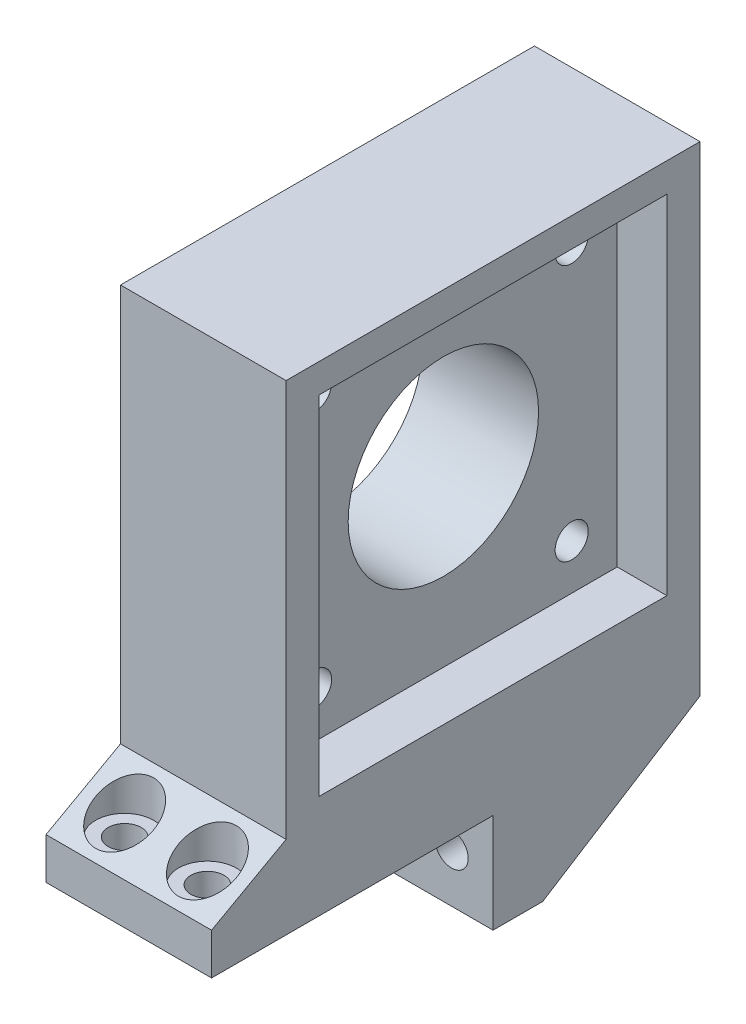
ISO-10303-21;
HEADER;
FILE_DESCRIPTION(('STEP AP214'),'2;1');
FILE_NAME('part.step','',(''),(''),'','','');
FILE_SCHEMA(('AUTOMOTIVE_DESIGN { 1 0 10303 214 1 1 1 1 }'));
ENDSEC;
DATA;
#1=APPLICATION_CONTEXT('core data for automotive mechanical design processes');
#2=APPLICATION_PROTOCOL_DEFINITION('international standard','automotive_design',2000,#1);
#3=PRODUCT_CONTEXT('',#1,'mechanical');
#4=PRODUCT('Part','Part','',(#3));
#5=PRODUCT_RELATED_PRODUCT_CATEGORY('part','',(#4));
#6=PRODUCT_DEFINITION_FORMATION('','',#4);
#7=PRODUCT_DEFINITION_CONTEXT('part definition',#1,'design');
#8=PRODUCT_DEFINITION('design','',#6,#7);
#9=PRODUCT_DEFINITION_SHAPE('','',#8);
#10=(LENGTH_UNIT() NAMED_UNIT(*) SI_UNIT(.MILLI.,.METRE.));
#11=(NAMED_UNIT(*) PLANE_ANGLE_UNIT() SI_UNIT($,.RADIAN.));
#12=(NAMED_UNIT(*) SI_UNIT($,.STERADIAN.) SOLID_ANGLE_UNIT());
#13=UNCERTAINTY_MEASURE_WITH_UNIT(LENGTH_MEASURE(1.E-05),#10,'distance_accuracy_value','');
#14=(GEOMETRIC_REPRESENTATION_CONTEXT(3) GLOBAL_UNCERTAINTY_ASSIGNED_CONTEXT((#13)) GLOBAL_UNIT_ASSIGNED_CONTEXT((#10,
#11,#12)) REPRESENTATION_CONTEXT('',''));
#15=CARTESIAN_POINT('',(0.,0.,0.));
#16=DIRECTION('',(0.,0.,1.));
#17=DIRECTION('',(1.,0.,0.));
#18=AXIS2_PLACEMENT_3D('',#15,#16,#17);
#19=CARTESIAN_POINT('',(-15.,22.,54.5));
#20=DIRECTION('',(0.,-1.,0.));
#21=DIRECTION('',(0.,0.,-1.));
#22=AXIS2_PLACEMENT_3D('',#19,#20,#21);
#23=CYLINDRICAL_SURFACE('',#22,2.00000000000001);
#24=CARTESIAN_POINT('',(-15.,12.,54.5));
#25=DIRECTION('',(0.,-1.,0.));
#26=DIRECTION('',(0.,0.,-1.));
#27=AXIS2_PLACEMENT_3D('',#24,#25,#26);
#28=CIRCLE('',#27,2.00000000000001);
#29=CARTESIAN_POINT('',(-15.,12.,52.5));
#30=VERTEX_POINT('',#29);
#31=EDGE_CURVE('E222',#30,#30,#28,.T.);
#32=ORIENTED_EDGE('',*,*,#31,.T.);
#33=EDGE_LOOP('',(#32));
#34=FACE_BOUND('',#33,.T.);
#35=CARTESIAN_POINT('',(-15.,17.,54.5));
#36=DIRECTION('',(0.,1.,0.));
#37=DIRECTION('',(0.,0.,1.));
#38=AXIS2_PLACEMENT_3D('',#35,#36,#37);
#39=CIRCLE('',#38,2.00000000000001);
#40=CARTESIAN_POINT('',(-15.,17.,56.5));
#41=VERTEX_POINT('',#40);
#42=EDGE_CURVE('E209',#41,#41,#39,.F.);
#43=ORIENTED_EDGE('',*,*,#42,.F.);
#44=EDGE_LOOP('',(#43));
#45=FACE_BOUND('',#44,.T.);
#46=ADVANCED_FACE('F39',(#34,#45),#23,.F.);
#47=CARTESIAN_POINT('',(-5.,22.,54.5));
#48=DIRECTION('',(0.,-1.,0.));
#49=DIRECTION('',(0.,0.,-1.));
#50=AXIS2_PLACEMENT_3D('',#47,#48,#49);
#51=CYLINDRICAL_SURFACE('',#50,2.);
#52=CARTESIAN_POINT('',(-5.,12.,54.5));
#53=DIRECTION('',(0.,-1.,0.));
#54=DIRECTION('',(0.,0.,-1.));
#55=AXIS2_PLACEMENT_3D('',#52,#53,#54);
#56=CIRCLE('',#55,2.);
#57=CARTESIAN_POINT('',(-5.,12.,52.5));
#58=VERTEX_POINT('',#57);
#59=EDGE_CURVE('E263',#58,#58,#56,.T.);
#60=ORIENTED_EDGE('',*,*,#59,.T.);
#61=EDGE_LOOP('',(#60));
#62=FACE_BOUND('',#61,.T.);
#63=CARTESIAN_POINT('',(-5.,17.,54.5));
#64=DIRECTION('',(0.,1.,0.));
#65=DIRECTION('',(0.,0.,1.));
#66=AXIS2_PLACEMENT_3D('',#63,#64,#65);
#67=CIRCLE('',#66,2.);
#68=CARTESIAN_POINT('',(-5.,17.,56.5));
#69=VERTEX_POINT('',#68);
#70=EDGE_CURVE('E205',#69,#69,#67,.F.);
#71=ORIENTED_EDGE('',*,*,#70,.F.);
#72=EDGE_LOOP('',(#71));
#73=FACE_BOUND('',#72,.T.);
#74=ADVANCED_FACE('F427',(#62,#73),#51,.F.);
#75=CARTESIAN_POINT('',(0.,70.,50.));
#76=DIRECTION('',(0.,0.,-1.));
#77=DIRECTION('',(-1.,0.,0.));
#78=AXIS2_PLACEMENT_3D('',#75,#76,#77);
#79=PLANE('',#78);
#80=DIRECTION('',(0.,-1.,0.));
#81=VECTOR('',#80,1.);
#82=CARTESIAN_POINT('',(-20.,70.,50.));
#83=LINE('',#82,#81);
#84=CARTESIAN_POINT('',(-20.,70.,50.));
#85=VERTEX_POINT('',#84);
#86=CARTESIAN_POINT('',(-20.,22.,50.));
#87=VERTEX_POINT('',#86);
#88=EDGE_CURVE('E155',#85,#87,#83,.T.);
#89=ORIENTED_EDGE('',*,*,#88,.T.);
#90=DIRECTION('',(1.,0.,0.));
#91=VECTOR('',#90,1.);
#92=CARTESIAN_POINT('',(-20.,22.,50.));
#93=LINE('',#92,#91);
#94=CARTESIAN_POINT('',(0.,22.,50.));
#95=VERTEX_POINT('',#94);
#96=EDGE_CURVE('E135',#87,#95,#93,.T.);
#97=ORIENTED_EDGE('',*,*,#96,.T.);
#98=DIRECTION('',(0.,-1.,0.));
#99=VECTOR('',#98,1.);
#100=CARTESIAN_POINT('',(0.,70.,50.));
#101=LINE('',#100,#99);
#102=CARTESIAN_POINT('',(0.,70.,50.));
#103=VERTEX_POINT('',#102);
#104=EDGE_CURVE('E165',#103,#95,#101,.T.);
#105=ORIENTED_EDGE('',*,*,#104,.F.);
#106=DIRECTION('',(1.,0.,0.));
#107=VECTOR('',#106,1.);
#108=CARTESIAN_POINT('',(0.,70.,50.));
#109=LINE('',#108,#107);
#110=EDGE_CURVE('E162',#85,#103,#109,.T.);
#111=ORIENTED_EDGE('',*,*,#110,.F.);
#112=EDGE_LOOP('',(#89,#97,#105,#111));
#113=FACE_BOUND('',#112,.T.);
#114=ADVANCED_FACE('F161',(#113),#79,.F.);
#115=CARTESIAN_POINT('',(0.,70.,0.));
#116=DIRECTION('',(-1.,0.,0.));
#117=DIRECTION('',(0.,0.,1.));
#118=AXIS2_PLACEMENT_3D('',#115,#116,#117);
#119=PLANE('',#118);
#120=ORIENTED_EDGE('',*,*,#104,.T.);
#121=DIRECTION('',(0.,-0.485642931178632,0.874157276121538));
#122=VECTOR('',#121,1.);
#123=CARTESIAN_POINT('',(0.,17.,59.));
#124=LINE('',#123,#122);
#125=CARTESIAN_POINT('',(0.,17.,59.));
#126=VERTEX_POINT('',#125);
#127=EDGE_CURVE('E141',#95,#126,#124,.T.);
#128=ORIENTED_EDGE('',*,*,#127,.T.);
#129=DIRECTION('',(0.,1.,0.));
#130=VECTOR('',#129,1.);
#131=CARTESIAN_POINT('',(0.,12.,59.));
#132=LINE('',#131,#130);
#133=CARTESIAN_POINT('',(0.,12.,59.));
#134=VERTEX_POINT('',#133);
#135=EDGE_CURVE('E147',#134,#126,#132,.T.);
#136=ORIENTED_EDGE('',*,*,#135,.F.);
#137=DIRECTION('',(0.,0.,1.));
#138=VECTOR('',#137,1.);
#139=CARTESIAN_POINT('',(0.,12.,50.));
#140=LINE('',#139,#138);
#141=CARTESIAN_POINT('',(0.,12.,25.));
#142=VERTEX_POINT('',#141);
#143=EDGE_CURVE('E356',#142,#134,#140,.T.);
#144=ORIENTED_EDGE('',*,*,#143,.F.);
#145=DIRECTION('',(0.,1.,0.));
#146=VECTOR('',#145,1.);
#147=CARTESIAN_POINT('',(0.,0.,25.));
#148=LINE('',#147,#146);
#149=CARTESIAN_POINT('',(0.,0.,25.));
#150=VERTEX_POINT('',#149);
#151=EDGE_CURVE('E352',#150,#142,#148,.T.);
#152=ORIENTED_EDGE('',*,*,#151,.F.);
#153=DIRECTION('',(0.,0.,-1.));
#154=VECTOR('',#153,1.);
#155=CARTESIAN_POINT('',(0.,0.,0.));
#156=LINE('',#155,#154);
#157=CARTESIAN_POINT('',(0.,0.,19.));
#158=VERTEX_POINT('',#157);
#159=EDGE_CURVE('E197',#150,#158,#156,.T.);
#160=ORIENTED_EDGE('',*,*,#159,.T.);
#161=DIRECTION('',(0.,-0.533992991387982,0.845488903030971));
#162=VECTOR('',#161,1.);
#163=CARTESIAN_POINT('',(0.,12.,0.));
#164=LINE('',#163,#162);
#165=CARTESIAN_POINT('',(0.,12.,0.));
#166=VERTEX_POINT('',#165);
#167=EDGE_CURVE('E57',#166,#158,#164,.T.);
#168=ORIENTED_EDGE('',*,*,#167,.F.);
#169=DIRECTION('',(0.,-1.,0.));
#170=VECTOR('',#169,1.);
#171=CARTESIAN_POINT('',(0.,70.,0.));
#172=LINE('',#171,#170);
#173=CARTESIAN_POINT('',(0.,70.,0.));
#174=VERTEX_POINT('',#173);
#175=EDGE_CURVE('E49',#174,#166,#172,.T.);
#176=ORIENTED_EDGE('',*,*,#175,.F.);
#177=DIRECTION('',(0.,0.,-1.));
#178=VECTOR('',#177,1.);
#179=CARTESIAN_POINT('',(0.,70.,0.));
#180=LINE('',#179,#178);
#181=EDGE_CURVE('E368',#103,#174,#180,.T.);
#182=ORIENTED_EDGE('',*,*,#181,.F.);
#183=EDGE_LOOP('',(#120,#128,#136,#144,#152,#160,#168,#176,#182));
#184=FACE_BOUND('',#183,.T.);
#185=DIRECTION('',(0.,0.,1.));
#186=VECTOR('',#185,1.);
#187=CARTESIAN_POINT('',(0.,66.5,4.));
#188=LINE('',#187,#186);
#189=CARTESIAN_POINT('',(0.,66.5,4.));
#190=VERTEX_POINT('',#189);
#191=CARTESIAN_POINT('',(0.,66.5,46.));
#192=VERTEX_POINT('',#191);
#193=EDGE_CURVE('E316',#190,#192,#188,.T.);
#194=ORIENTED_EDGE('',*,*,#193,.F.);
#195=DIRECTION('',(0.,1.,0.));
#196=VECTOR('',#195,1.);
#197=CARTESIAN_POINT('',(0.,66.5,4.));
#198=LINE('',#197,#196);
#199=CARTESIAN_POINT('',(0.,24.5,3.99999999999999));
#200=VERTEX_POINT('',#199);
#201=EDGE_CURVE('E65',#200,#190,#198,.T.);
#202=ORIENTED_EDGE('',*,*,#201,.F.);
#203=DIRECTION('',(0.,0.,-1.));
#204=VECTOR('',#203,1.);
#205=CARTESIAN_POINT('',(0.,24.5,3.99999999999999));
#206=LINE('',#205,#204);
#207=CARTESIAN_POINT('',(0.,24.5,46.));
#208=VERTEX_POINT('',#207);
#209=EDGE_CURVE('E301',#208,#200,#206,.T.);
#210=ORIENTED_EDGE('',*,*,#209,.F.);
#211=DIRECTION('',(0.,-1.,0.));
#212=VECTOR('',#211,1.);
#213=CARTESIAN_POINT('',(0.,66.5,46.));
#214=LINE('',#213,#212);
#215=EDGE_CURVE('E320',#192,#208,#214,.T.);
#216=ORIENTED_EDGE('',*,*,#215,.F.);
#217=EDGE_LOOP('',(#194,#202,#210,#216));
#218=FACE_BOUND('',#217,.T.);
#219=ADVANCED_FACE('F41',(#184,#218),#119,.F.);
#220=CARTESIAN_POINT('',(0.,70.,0.));
#221=DIRECTION('',(0.,0.,1.));
#222=DIRECTION('',(1.,0.,0.));
#223=AXIS2_PLACEMENT_3D('',#220,#221,#222);
#224=PLANE('',#223);
#225=ORIENTED_EDGE('',*,*,#175,.T.);
#226=DIRECTION('',(1.,0.,0.));
#227=VECTOR('',#226,1.);
#228=CARTESIAN_POINT('',(-30.,12.,0.));
#229=LINE('',#228,#227);
#230=CARTESIAN_POINT('',(-20.,12.,0.));
#231=VERTEX_POINT('',#230);
#232=EDGE_CURVE('E287',#231,#166,#229,.T.);
#233=ORIENTED_EDGE('',*,*,#232,.F.);
#234=DIRECTION('',(0.,-1.,0.));
#235=VECTOR('',#234,1.);
#236=CARTESIAN_POINT('',(-20.,70.,0.));
#237=LINE('',#236,#235);
#238=CARTESIAN_POINT('',(-20.,70.,0.));
#239=VERTEX_POINT('',#238);
#240=EDGE_CURVE('E164',#239,#231,#237,.T.);
#241=ORIENTED_EDGE('',*,*,#240,.F.);
#242=DIRECTION('',(-1.,0.,0.));
#243=VECTOR('',#242,1.);
#244=CARTESIAN_POINT('',(0.,70.,0.));
#245=LINE('',#244,#243);
#246=EDGE_CURVE('E372',#174,#239,#245,.T.);
#247=ORIENTED_EDGE('',*,*,#246,.F.);
#248=EDGE_LOOP('',(#225,#233,#241,#247));
#249=FACE_BOUND('',#248,.T.);
#250=ADVANCED_FACE('F410',(#249),#224,.F.);
#251=CARTESIAN_POINT('',(-20.,70.,0.));
#252=DIRECTION('',(1.,0.,0.));
#253=DIRECTION('',(0.,0.,-1.));
#254=AXIS2_PLACEMENT_3D('',#251,#252,#253);
#255=PLANE('',#254);
#256=DIRECTION('',(0.,-0.485642931178632,0.874157276121538));
#257=VECTOR('',#256,1.);
#258=CARTESIAN_POINT('',(-20.,17.,59.));
#259=LINE('',#258,#257);
#260=CARTESIAN_POINT('',(-20.,17.,59.));
#261=VERTEX_POINT('',#260);
#262=EDGE_CURVE('E138',#87,#261,#259,.T.);
#263=ORIENTED_EDGE('',*,*,#262,.F.);
#264=ORIENTED_EDGE('',*,*,#88,.F.);
#265=DIRECTION('',(0.,0.,1.));
#266=VECTOR('',#265,1.);
#267=CARTESIAN_POINT('',(-20.,70.,0.));
#268=LINE('',#267,#266);
#269=EDGE_CURVE('E376',#239,#85,#268,.T.);
#270=ORIENTED_EDGE('',*,*,#269,.F.);
#271=ORIENTED_EDGE('',*,*,#240,.T.);
#272=DIRECTION('',(0.,-0.533992991387982,0.845488903030971));
#273=VECTOR('',#272,1.);
#274=CARTESIAN_POINT('',(-20.,28.5386138613861,-26.1861386138614));
#275=LINE('',#274,#273);
#276=CARTESIAN_POINT('',(-20.,0.,19.));
#277=VERTEX_POINT('',#276);
#278=EDGE_CURVE('E290',#231,#277,#275,.T.);
#279=ORIENTED_EDGE('',*,*,#278,.T.);
#280=DIRECTION('',(0.,0.,1.));
#281=VECTOR('',#280,1.);
#282=CARTESIAN_POINT('',(-20.,0.,0.));
#283=LINE('',#282,#281);
#284=CARTESIAN_POINT('',(-20.,0.,25.));
#285=VERTEX_POINT('',#284);
#286=EDGE_CURVE('E373',#277,#285,#283,.T.);
#287=ORIENTED_EDGE('',*,*,#286,.T.);
#288=DIRECTION('',(0.,1.,0.));
#289=VECTOR('',#288,1.);
#290=CARTESIAN_POINT('',(-20.,70.,25.));
#291=LINE('',#290,#289);
#292=CARTESIAN_POINT('',(-20.,12.,25.));
#293=VERTEX_POINT('',#292);
#294=EDGE_CURVE('E362',#285,#293,#291,.T.);
#295=ORIENTED_EDGE('',*,*,#294,.T.);
#296=DIRECTION('',(0.,0.,1.));
#297=VECTOR('',#296,1.);
#298=CARTESIAN_POINT('',(-20.,12.,0.));
#299=LINE('',#298,#297);
#300=CARTESIAN_POINT('',(-20.,12.,59.));
#301=VERTEX_POINT('',#300);
#302=EDGE_CURVE('E182',#293,#301,#299,.T.);
#303=ORIENTED_EDGE('',*,*,#302,.T.);
#304=DIRECTION('',(0.,-1.,0.));
#305=VECTOR('',#304,1.);
#306=CARTESIAN_POINT('',(-20.,12.,59.));
#307=LINE('',#306,#305);
#308=EDGE_CURVE('E158',#261,#301,#307,.T.);
#309=ORIENTED_EDGE('',*,*,#308,.F.);
#310=EDGE_LOOP('',(#263,#264,#270,#271,#279,#287,#295,#303,#309));
#311=FACE_BOUND('',#310,.T.);
#312=CARTESIAN_POINT('',(-20.,45.5,25.));
#313=DIRECTION('',(1.,0.,0.));
#314=DIRECTION('',(0.,0.,-1.));
#315=AXIS2_PLACEMENT_3D('',#312,#313,#314);
#316=CIRCLE('',#315,11.5);
#317=CARTESIAN_POINT('',(-20.,45.5,13.5));
#318=VERTEX_POINT('',#317);
#319=EDGE_CURVE('E194',#318,#318,#316,.T.);
#320=ORIENTED_EDGE('',*,*,#319,.T.);
#321=EDGE_LOOP('',(#320));
#322=FACE_BOUND('',#321,.T.);
#323=CARTESIAN_POINT('',(-20.,61.,40.5));
#324=DIRECTION('',(1.,0.,0.));
#325=DIRECTION('',(0.,0.,-1.));
#326=AXIS2_PLACEMENT_3D('',#323,#324,#325);
#327=CIRCLE('',#326,2.00000000000001);
#328=CARTESIAN_POINT('',(-20.,61.,38.5));
#329=VERTEX_POINT('',#328);
#330=EDGE_CURVE('E190',#329,#329,#327,.T.);
#331=ORIENTED_EDGE('',*,*,#330,.T.);
#332=EDGE_LOOP('',(#331));
#333=FACE_BOUND('',#332,.T.);
#334=CARTESIAN_POINT('',(-20.,30.,40.5));
#335=DIRECTION('',(1.,0.,0.));
#336=DIRECTION('',(0.,0.,-1.));
#337=AXIS2_PLACEMENT_3D('',#334,#335,#336);
#338=CIRCLE('',#337,2.);
#339=CARTESIAN_POINT('',(-20.,30.,38.5));
#340=VERTEX_POINT('',#339);
#341=EDGE_CURVE('E186',#340,#340,#338,.T.);
#342=ORIENTED_EDGE('',*,*,#341,.T.);
#343=EDGE_LOOP('',(#342));
#344=FACE_BOUND('',#343,.T.);
#345=CARTESIAN_POINT('',(-20.,30.,9.5));
#346=DIRECTION('',(1.,0.,0.));
#347=DIRECTION('',(0.,0.,-1.));
#348=AXIS2_PLACEMENT_3D('',#345,#346,#347);
#349=CIRCLE('',#348,2.00000000000001);
#350=CARTESIAN_POINT('',(-20.,30.,7.49999999999999));
#351=VERTEX_POINT('',#350);
#352=EDGE_CURVE('E181',#351,#351,#349,.T.);
#353=ORIENTED_EDGE('',*,*,#352,.T.);
#354=EDGE_LOOP('',(#353));
#355=FACE_BOUND('',#354,.T.);
#356=CARTESIAN_POINT('',(-20.,61.,9.5));
#357=DIRECTION('',(1.,0.,0.));
#358=DIRECTION('',(0.,0.,-1.));
#359=AXIS2_PLACEMENT_3D('',#356,#357,#358);
#360=CIRCLE('',#359,2.00000000000001);
#361=CARTESIAN_POINT('',(-20.,61.,7.5));
#362=VERTEX_POINT('',#361);
#363=EDGE_CURVE('E177',#362,#362,#360,.T.);
#364=ORIENTED_EDGE('',*,*,#363,.T.);
#365=EDGE_LOOP('',(#364));
#366=FACE_BOUND('',#365,.T.);
#367=ADVANCED_FACE('F152',(#311,#322,#333,#344,#355,#366),#255,.F.);
#368=CARTESIAN_POINT('',(0.,70.,0.));
#369=DIRECTION('',(0.,-1.,0.));
#370=DIRECTION('',(0.,0.,-1.));
#371=AXIS2_PLACEMENT_3D('',#368,#369,#370);
#372=PLANE('',#371);
#373=ORIENTED_EDGE('',*,*,#181,.T.);
#374=ORIENTED_EDGE('',*,*,#246,.T.);
#375=ORIENTED_EDGE('',*,*,#269,.T.);
#376=ORIENTED_EDGE('',*,*,#110,.T.);
#377=EDGE_LOOP('',(#373,#374,#375,#376));
#378=FACE_BOUND('',#377,.T.);
#379=ADVANCED_FACE('F406',(#378),#372,.F.);
#380=CARTESIAN_POINT('',(0.,0.,0.));
#381=DIRECTION('',(0.,-1.,0.));
#382=DIRECTION('',(0.,0.,-1.));
#383=AXIS2_PLACEMENT_3D('',#380,#381,#382);
#384=PLANE('',#383);
#385=DIRECTION('',(1.,0.,0.));
#386=VECTOR('',#385,1.);
#387=CARTESIAN_POINT('',(-30.,0.,19.));
#388=LINE('',#387,#386);
#389=EDGE_CURVE('E286',#277,#158,#388,.T.);
#390=ORIENTED_EDGE('',*,*,#389,.T.);
#391=ORIENTED_EDGE('',*,*,#159,.F.);
#392=DIRECTION('',(1.,0.,0.));
#393=VECTOR('',#392,1.);
#394=CARTESIAN_POINT('',(0.,0.,25.));
#395=LINE('',#394,#393);
#396=EDGE_CURVE('E11',#285,#150,#395,.T.);
#397=ORIENTED_EDGE('',*,*,#396,.F.);
#398=ORIENTED_EDGE('',*,*,#286,.F.);
#399=EDGE_LOOP('',(#390,#391,#397,#398));
#400=FACE_BOUND('',#399,.T.);
#401=ADVANCED_FACE('F393',(#400),#384,.T.);
#402=CARTESIAN_POINT('',(-60.,61.,9.50000000000001));
#403=DIRECTION('',(1.,0.,0.));
#404=DIRECTION('',(0.,0.,-1.));
#405=AXIS2_PLACEMENT_3D('',#402,#403,#404);
#406=CYLINDRICAL_SURFACE('',#405,2.00000000000001);
#407=CARTESIAN_POINT('',(-6.,61.,9.5));
#408=DIRECTION('',(-1.,0.,0.));
#409=DIRECTION('',(0.,0.,1.));
#410=AXIS2_PLACEMENT_3D('',#407,#408,#409);
#411=CIRCLE('',#410,2.00000000000001);
#412=CARTESIAN_POINT('',(-6.,61.,11.5));
#413=VERTEX_POINT('',#412);
#414=EDGE_CURVE('E348',#413,#413,#411,.F.);
#415=ORIENTED_EDGE('',*,*,#414,.T.);
#416=EDGE_LOOP('',(#415));
#417=FACE_BOUND('',#416,.T.);
#418=ORIENTED_EDGE('',*,*,#363,.F.);
#419=EDGE_LOOP('',(#418));
#420=FACE_BOUND('',#419,.T.);
#421=ADVANCED_FACE('F513',(#417,#420),#406,.F.);
#422=CARTESIAN_POINT('',(-60.,30.,9.5));
#423=DIRECTION('',(1.,0.,0.));
#424=DIRECTION('',(0.,0.,-1.));
#425=AXIS2_PLACEMENT_3D('',#422,#423,#424);
#426=CYLINDRICAL_SURFACE('',#425,2.00000000000001);
#427=CARTESIAN_POINT('',(-6.,30.,9.5));
#428=DIRECTION('',(-1.,0.,0.));
#429=DIRECTION('',(0.,0.,1.));
#430=AXIS2_PLACEMENT_3D('',#427,#428,#429);
#431=CIRCLE('',#430,2.00000000000001);
#432=CARTESIAN_POINT('',(-6.,30.,11.5));
#433=VERTEX_POINT('',#432);
#434=EDGE_CURVE('E344',#433,#433,#431,.F.);
#435=ORIENTED_EDGE('',*,*,#434,.T.);
#436=EDGE_LOOP('',(#435));
#437=FACE_BOUND('',#436,.T.);
#438=ORIENTED_EDGE('',*,*,#352,.F.);
#439=EDGE_LOOP('',(#438));
#440=FACE_BOUND('',#439,.T.);
#441=ADVANCED_FACE('F509',(#437,#440),#426,.F.);
#442=CARTESIAN_POINT('',(-60.,30.,40.5));
#443=DIRECTION('',(1.,0.,0.));
#444=DIRECTION('',(0.,0.,-1.));
#445=AXIS2_PLACEMENT_3D('',#442,#443,#444);
#446=CYLINDRICAL_SURFACE('',#445,2.);
#447=CARTESIAN_POINT('',(-5.99999999999999,30.,40.5));
#448=DIRECTION('',(-1.,0.,0.));
#449=DIRECTION('',(0.,0.,1.));
#450=AXIS2_PLACEMENT_3D('',#447,#448,#449);
#451=CIRCLE('',#450,2.);
#452=CARTESIAN_POINT('',(-5.99999999999999,30.,42.5));
#453=VERTEX_POINT('',#452);
#454=EDGE_CURVE('E340',#453,#453,#451,.F.);
#455=ORIENTED_EDGE('',*,*,#454,.T.);
#456=EDGE_LOOP('',(#455));
#457=FACE_BOUND('',#456,.T.);
#458=ORIENTED_EDGE('',*,*,#341,.F.);
#459=EDGE_LOOP('',(#458));
#460=FACE_BOUND('',#459,.T.);
#461=ADVANCED_FACE('F512',(#457,#460),#446,.F.);
#462=CARTESIAN_POINT('',(-60.,61.,40.5));
#463=DIRECTION('',(1.,0.,0.));
#464=DIRECTION('',(0.,0.,-1.));
#465=AXIS2_PLACEMENT_3D('',#462,#463,#464);
#466=CYLINDRICAL_SURFACE('',#465,2.00000000000001);
#467=CARTESIAN_POINT('',(-5.99999999999999,61.,40.5));
#468=DIRECTION('',(-1.,0.,0.));
#469=DIRECTION('',(0.,0.,1.));
#470=AXIS2_PLACEMENT_3D('',#467,#468,#469);
#471=CIRCLE('',#470,2.00000000000001);
#472=CARTESIAN_POINT('',(-5.99999999999999,61.,42.5));
#473=VERTEX_POINT('',#472);
#474=EDGE_CURVE('E203',#473,#473,#471,.F.);
#475=ORIENTED_EDGE('',*,*,#474,.T.);
#476=EDGE_LOOP('',(#475));
#477=FACE_BOUND('',#476,.T.);
#478=ORIENTED_EDGE('',*,*,#330,.F.);
#479=EDGE_LOOP('',(#478));
#480=FACE_BOUND('',#479,.T.);
#481=ADVANCED_FACE('F517',(#477,#480),#466,.F.);
#482=CARTESIAN_POINT('',(-60.,45.5,25.));
#483=DIRECTION('',(1.,0.,0.));
#484=DIRECTION('',(0.,0.,-1.));
#485=AXIS2_PLACEMENT_3D('',#482,#483,#484);
#486=CYLINDRICAL_SURFACE('',#485,11.5);
#487=CARTESIAN_POINT('',(-6.,45.5,25.));
#488=DIRECTION('',(-1.,0.,0.));
#489=DIRECTION('',(0.,0.,1.));
#490=AXIS2_PLACEMENT_3D('',#487,#488,#489);
#491=CIRCLE('',#490,11.5);
#492=CARTESIAN_POINT('',(-6.,45.5,36.5));
#493=VERTEX_POINT('',#492);
#494=EDGE_CURVE('E199',#493,#493,#491,.F.);
#495=ORIENTED_EDGE('',*,*,#494,.T.);
#496=EDGE_LOOP('',(#495));
#497=FACE_BOUND('',#496,.T.);
#498=ORIENTED_EDGE('',*,*,#319,.F.);
#499=EDGE_LOOP('',(#498));
#500=FACE_BOUND('',#499,.T.);
#501=ADVANCED_FACE('F504',(#497,#500),#486,.F.);
#502=CARTESIAN_POINT('',(-60.,12.,50.));
#503=DIRECTION('',(0.,1.,0.));
#504=DIRECTION('',(0.,0.,1.));
#505=AXIS2_PLACEMENT_3D('',#502,#503,#504);
#506=PLANE('',#505);
#507=ORIENTED_EDGE('',*,*,#59,.F.);
#508=EDGE_LOOP('',(#507));
#509=FACE_BOUND('',#508,.T.);
#510=ORIENTED_EDGE('',*,*,#31,.F.);
#511=EDGE_LOOP('',(#510));
#512=FACE_BOUND('',#511,.T.);
#513=DIRECTION('',(1.,0.,0.));
#514=VECTOR('',#513,1.);
#515=CARTESIAN_POINT('',(-60.,12.,25.));
#516=LINE('',#515,#514);
#517=EDGE_CURVE('E359',#293,#142,#516,.T.);
#518=ORIENTED_EDGE('',*,*,#517,.T.);
#519=ORIENTED_EDGE('',*,*,#143,.T.);
#520=DIRECTION('',(1.,0.,0.));
#521=VECTOR('',#520,1.);
#522=CARTESIAN_POINT('',(0.,12.,59.));
#523=LINE('',#522,#521);
#524=EDGE_CURVE('E280',#301,#134,#523,.T.);
#525=ORIENTED_EDGE('',*,*,#524,.F.);
#526=ORIENTED_EDGE('',*,*,#302,.F.);
#527=EDGE_LOOP('',(#518,#519,#525,#526));
#528=FACE_BOUND('',#527,.T.);
#529=ADVANCED_FACE('F401',(#509,#512,#528),#506,.F.);
#530=CARTESIAN_POINT('',(-60.,0.,25.));
#531=DIRECTION('',(0.,0.,-1.));
#532=DIRECTION('',(-1.,0.,0.));
#533=AXIS2_PLACEMENT_3D('',#530,#531,#532);
#534=PLANE('',#533);
#535=CARTESIAN_POINT('',(-5.,6.,25.));
#536=DIRECTION('',(0.,0.,-1.));
#537=DIRECTION('',(-1.,0.,0.));
#538=AXIS2_PLACEMENT_3D('',#535,#536,#537);
#539=CIRCLE('',#538,2.);
#540=CARTESIAN_POINT('',(-7.,6.,25.));
#541=VERTEX_POINT('',#540);
#542=EDGE_CURVE('E43',#541,#541,#539,.T.);
#543=ORIENTED_EDGE('',*,*,#542,.T.);
#544=EDGE_LOOP('',(#543));
#545=FACE_BOUND('',#544,.T.);
#546=CARTESIAN_POINT('',(-15.,6.,25.));
#547=DIRECTION('',(0.,0.,-1.));
#548=DIRECTION('',(-1.,0.,0.));
#549=AXIS2_PLACEMENT_3D('',#546,#547,#548);
#550=CIRCLE('',#549,2.);
#551=CARTESIAN_POINT('',(-17.,6.,25.));
#552=VERTEX_POINT('',#551);
#553=EDGE_CURVE('E232',#552,#552,#550,.T.);
#554=ORIENTED_EDGE('',*,*,#553,.T.);
#555=EDGE_LOOP('',(#554));
#556=FACE_BOUND('',#555,.T.);
#557=ORIENTED_EDGE('',*,*,#396,.T.);
#558=ORIENTED_EDGE('',*,*,#151,.T.);
#559=ORIENTED_EDGE('',*,*,#517,.F.);
#560=ORIENTED_EDGE('',*,*,#294,.F.);
#561=EDGE_LOOP('',(#557,#558,#559,#560));
#562=FACE_BOUND('',#561,.T.);
#563=ADVANCED_FACE('F390',(#545,#556,#562),#534,.F.);
#564=CARTESIAN_POINT('',(-6.,0.,0.));
#565=DIRECTION('',(-1.,0.,0.));
#566=DIRECTION('',(0.,0.,1.));
#567=AXIS2_PLACEMENT_3D('',#564,#565,#566);
#568=PLANE('',#567);
#569=ORIENTED_EDGE('',*,*,#434,.F.);
#570=EDGE_LOOP('',(#569));
#571=FACE_BOUND('',#570,.T.);
#572=ORIENTED_EDGE('',*,*,#474,.F.);
#573=EDGE_LOOP('',(#572));
#574=FACE_BOUND('',#573,.T.);
#575=DIRECTION('',(0.,1.,0.));
#576=VECTOR('',#575,1.);
#577=CARTESIAN_POINT('',(-6.,66.5,4.));
#578=LINE('',#577,#576);
#579=CARTESIAN_POINT('',(-6.,24.5,3.99999999999999));
#580=VERTEX_POINT('',#579);
#581=CARTESIAN_POINT('',(-6.,66.5,4.));
#582=VERTEX_POINT('',#581);
#583=EDGE_CURVE('E296',#580,#582,#578,.T.);
#584=ORIENTED_EDGE('',*,*,#583,.T.);
#585=DIRECTION('',(0.,0.,1.));
#586=VECTOR('',#585,1.);
#587=CARTESIAN_POINT('',(-6.,66.5,4.));
#588=LINE('',#587,#586);
#589=CARTESIAN_POINT('',(-5.99999999999999,66.5,46.));
#590=VERTEX_POINT('',#589);
#591=EDGE_CURVE('E300',#582,#590,#588,.T.);
#592=ORIENTED_EDGE('',*,*,#591,.T.);
#593=DIRECTION('',(0.,-1.,0.));
#594=VECTOR('',#593,1.);
#595=CARTESIAN_POINT('',(-5.99999999999999,66.5,46.));
#596=LINE('',#595,#594);
#597=CARTESIAN_POINT('',(-5.99999999999999,24.5,46.));
#598=VERTEX_POINT('',#597);
#599=EDGE_CURVE('E305',#590,#598,#596,.T.);
#600=ORIENTED_EDGE('',*,*,#599,.T.);
#601=DIRECTION('',(0.,0.,-1.));
#602=VECTOR('',#601,1.);
#603=CARTESIAN_POINT('',(-6.,24.5,3.99999999999999));
#604=LINE('',#603,#602);
#605=EDGE_CURVE('E309',#598,#580,#604,.T.);
#606=ORIENTED_EDGE('',*,*,#605,.T.);
#607=EDGE_LOOP('',(#584,#592,#600,#606));
#608=FACE_BOUND('',#607,.T.);
#609=ORIENTED_EDGE('',*,*,#494,.F.);
#610=EDGE_LOOP('',(#609));
#611=FACE_BOUND('',#610,.T.);
#612=ORIENTED_EDGE('',*,*,#454,.F.);
#613=EDGE_LOOP('',(#612));
#614=FACE_BOUND('',#613,.T.);
#615=ORIENTED_EDGE('',*,*,#414,.F.);
#616=EDGE_LOOP('',(#615));
#617=FACE_BOUND('',#616,.T.);
#618=ADVANCED_FACE('F496',(#571,#574,#608,#611,#614,#617),#568,.F.);
#619=CARTESIAN_POINT('',(-6.,66.5,4.));
#620=DIRECTION('',(0.,0.,-1.));
#621=DIRECTION('',(0.,1.,0.));
#622=AXIS2_PLACEMENT_3D('',#619,#620,#621);
#623=PLANE('',#622);
#624=ORIENTED_EDGE('',*,*,#201,.T.);
#625=DIRECTION('',(1.,0.,0.));
#626=VECTOR('',#625,1.);
#627=CARTESIAN_POINT('',(-6.,66.5,4.));
#628=LINE('',#627,#626);
#629=EDGE_CURVE('E313',#582,#190,#628,.T.);
#630=ORIENTED_EDGE('',*,*,#629,.F.);
#631=ORIENTED_EDGE('',*,*,#583,.F.);
#632=DIRECTION('',(1.,0.,0.));
#633=VECTOR('',#632,1.);
#634=CARTESIAN_POINT('',(-6.,24.5,3.99999999999999));
#635=LINE('',#634,#633);
#636=EDGE_CURVE('E204',#580,#200,#635,.T.);
#637=ORIENTED_EDGE('',*,*,#636,.T.);
#638=EDGE_LOOP('',(#624,#630,#631,#637));
#639=FACE_BOUND('',#638,.T.);
#640=ADVANCED_FACE('F502',(#639),#623,.F.);
#641=CARTESIAN_POINT('',(-6.,24.5,3.99999999999999));
#642=DIRECTION('',(0.,-1.,0.));
#643=DIRECTION('',(0.,0.,-1.));
#644=AXIS2_PLACEMENT_3D('',#641,#642,#643);
#645=PLANE('',#644);
#646=ORIENTED_EDGE('',*,*,#209,.T.);
#647=ORIENTED_EDGE('',*,*,#636,.F.);
#648=ORIENTED_EDGE('',*,*,#605,.F.);
#649=DIRECTION('',(1.,0.,0.));
#650=VECTOR('',#649,1.);
#651=CARTESIAN_POINT('',(-5.99999999999999,24.5,46.));
#652=LINE('',#651,#650);
#653=EDGE_CURVE('E329',#598,#208,#652,.T.);
#654=ORIENTED_EDGE('',*,*,#653,.T.);
#655=EDGE_LOOP('',(#646,#647,#648,#654));
#656=FACE_BOUND('',#655,.T.);
#657=ADVANCED_FACE('F645',(#656),#645,.F.);
#658=CARTESIAN_POINT('',(-5.99999999999999,66.5,46.));
#659=DIRECTION('',(0.,0.,1.));
#660=DIRECTION('',(0.,-1.,0.));
#661=AXIS2_PLACEMENT_3D('',#658,#659,#660);
#662=PLANE('',#661);
#663=ORIENTED_EDGE('',*,*,#215,.T.);
#664=ORIENTED_EDGE('',*,*,#653,.F.);
#665=ORIENTED_EDGE('',*,*,#599,.F.);
#666=DIRECTION('',(1.,0.,0.));
#667=VECTOR('',#666,1.);
#668=CARTESIAN_POINT('',(-5.99999999999999,66.5,46.));
#669=LINE('',#668,#667);
#670=EDGE_CURVE('E332',#590,#192,#669,.T.);
#671=ORIENTED_EDGE('',*,*,#670,.T.);
#672=EDGE_LOOP('',(#663,#664,#665,#671));
#673=FACE_BOUND('',#672,.T.);
#674=ADVANCED_FACE('F421',(#673),#662,.F.);
#675=CARTESIAN_POINT('',(-6.,66.5,4.));
#676=DIRECTION('',(0.,1.,0.));
#677=DIRECTION('',(0.,0.,1.));
#678=AXIS2_PLACEMENT_3D('',#675,#676,#677);
#679=PLANE('',#678);
#680=ORIENTED_EDGE('',*,*,#193,.T.);
#681=ORIENTED_EDGE('',*,*,#670,.F.);
#682=ORIENTED_EDGE('',*,*,#591,.F.);
#683=ORIENTED_EDGE('',*,*,#629,.T.);
#684=EDGE_LOOP('',(#680,#681,#682,#683));
#685=FACE_BOUND('',#684,.T.);
#686=ADVANCED_FACE('F413',(#685),#679,.F.);
#687=CARTESIAN_POINT('',(-30.,12.,0.));
#688=DIRECTION('',(0.,0.845488903030971,0.533992991387982));
#689=DIRECTION('',(0.,-0.533992991387982,0.845488903030971));
#690=AXIS2_PLACEMENT_3D('',#687,#688,#689);
#691=PLANE('',#690);
#692=CARTESIAN_POINT('',(-15.,6.,9.5));
#693=DIRECTION('',(0.,0.845488903030971,0.533992991387982));
#694=DIRECTION('',(0.,0.533992991387982,-0.845488903030971));
#695=AXIS2_PLACEMENT_3D('',#692,#693,#694);
#696=ELLIPSE('',#695,6.55439314082123,3.5);
#697=CARTESIAN_POINT('',(-15.,9.5,3.95833333333333));
#698=VERTEX_POINT('',#697);
#699=EDGE_CURVE('E227',#698,#698,#696,.T.);
#700=ORIENTED_EDGE('',*,*,#699,.T.);
#701=EDGE_LOOP('',(#700));
#702=FACE_BOUND('',#701,.T.);
#703=CARTESIAN_POINT('',(-5.,6.,9.5));
#704=DIRECTION('',(0.,0.845488903030971,0.533992991387982));
#705=DIRECTION('',(0.,0.533992991387982,-0.845488903030971));
#706=AXIS2_PLACEMENT_3D('',#703,#704,#705);
#707=ELLIPSE('',#706,6.55439314082123,3.5);
#708=CARTESIAN_POINT('',(-5.,9.5,3.95833333333333));
#709=VERTEX_POINT('',#708);
#710=EDGE_CURVE('E223',#709,#709,#707,.T.);
#711=ORIENTED_EDGE('',*,*,#710,.T.);
#712=EDGE_LOOP('',(#711));
#713=FACE_BOUND('',#712,.T.);
#714=ORIENTED_EDGE('',*,*,#232,.T.);
#715=ORIENTED_EDGE('',*,*,#167,.T.);
#716=ORIENTED_EDGE('',*,*,#389,.F.);
#717=ORIENTED_EDGE('',*,*,#278,.F.);
#718=EDGE_LOOP('',(#714,#715,#716,#717));
#719=FACE_BOUND('',#718,.T.);
#720=ADVANCED_FACE('F411',(#702,#713,#719),#691,.F.);
#721=CARTESIAN_POINT('',(0.,0.,59.));
#722=DIRECTION('',(0.,0.,1.));
#723=DIRECTION('',(1.,0.,0.));
#724=AXIS2_PLACEMENT_3D('',#721,#722,#723);
#725=PLANE('',#724);
#726=ORIENTED_EDGE('',*,*,#135,.T.);
#727=DIRECTION('',(-1.,0.,0.));
#728=VECTOR('',#727,1.);
#729=CARTESIAN_POINT('',(0.,17.,59.));
#730=LINE('',#729,#728);
#731=EDGE_CURVE('E275',#126,#261,#730,.T.);
#732=ORIENTED_EDGE('',*,*,#731,.T.);
#733=ORIENTED_EDGE('',*,*,#308,.T.);
#734=ORIENTED_EDGE('',*,*,#524,.T.);
#735=EDGE_LOOP('',(#726,#732,#733,#734));
#736=FACE_BOUND('',#735,.T.);
#737=ADVANCED_FACE('F403',(#736),#725,.T.);
#738=CARTESIAN_POINT('',(-20.,17.,59.));
#739=DIRECTION('',(0.,0.874157276121538,0.485642931178632));
#740=DIRECTION('',(0.,-0.485642931178632,0.874157276121538));
#741=AXIS2_PLACEMENT_3D('',#738,#739,#740);
#742=PLANE('',#741);
#743=CARTESIAN_POINT('',(-15.,19.5,54.5));
#744=DIRECTION('',(0.,0.874157276121538,0.485642931178632));
#745=DIRECTION('',(0.,0.485642931178632,-0.874157276121538));
#746=AXIS2_PLACEMENT_3D('',#743,#744,#745);
#747=ELLIPSE('',#746,4.0038561659394,3.50000000000001);
#748=CARTESIAN_POINT('',(-15.,21.4444444444444,51.));
#749=VERTEX_POINT('',#748);
#750=EDGE_CURVE('E218',#749,#749,#747,.T.);
#751=ORIENTED_EDGE('',*,*,#750,.F.);
#752=EDGE_LOOP('',(#751));
#753=FACE_BOUND('',#752,.T.);
#754=CARTESIAN_POINT('',(-5.,19.5,54.5));
#755=DIRECTION('',(0.,0.874157276121538,0.485642931178632));
#756=DIRECTION('',(0.,0.485642931178632,-0.874157276121538));
#757=AXIS2_PLACEMENT_3D('',#754,#755,#756);
#758=ELLIPSE('',#757,4.00385616593939,3.5);
#759=CARTESIAN_POINT('',(-5.,21.4444444444444,51.));
#760=VERTEX_POINT('',#759);
#761=EDGE_CURVE('E214',#760,#760,#758,.T.);
#762=ORIENTED_EDGE('',*,*,#761,.F.);
#763=EDGE_LOOP('',(#762));
#764=FACE_BOUND('',#763,.T.);
#765=ORIENTED_EDGE('',*,*,#127,.F.);
#766=ORIENTED_EDGE('',*,*,#96,.F.);
#767=ORIENTED_EDGE('',*,*,#262,.T.);
#768=ORIENTED_EDGE('',*,*,#731,.F.);
#769=EDGE_LOOP('',(#765,#766,#767,#768));
#770=FACE_BOUND('',#769,.T.);
#771=ADVANCED_FACE('F137',(#753,#764,#770),#742,.T.);
#772=CARTESIAN_POINT('',(-5.,17.,54.5));
#773=DIRECTION('',(0.,1.,0.));
#774=DIRECTION('',(0.,0.,1.));
#775=AXIS2_PLACEMENT_3D('',#772,#773,#774);
#776=PLANE('',#775);
#777=CARTESIAN_POINT('',(-5.,17.,54.5));
#778=DIRECTION('',(0.,1.,0.));
#779=DIRECTION('',(0.,0.,1.));
#780=AXIS2_PLACEMENT_3D('',#777,#778,#779);
#781=CIRCLE('',#780,3.5);
#782=CARTESIAN_POINT('',(-5.,17.,58.));
#783=VERTEX_POINT('',#782);
#784=EDGE_CURVE('E231',#783,#783,#781,.T.);
#785=ORIENTED_EDGE('',*,*,#784,.T.);
#786=EDGE_LOOP('',(#785));
#787=FACE_BOUND('',#786,.T.);
#788=ORIENTED_EDGE('',*,*,#70,.T.);
#789=EDGE_LOOP('',(#788));
#790=FACE_BOUND('',#789,.T.);
#791=ADVANCED_FACE('F439',(#787,#790),#776,.T.);
#792=CARTESIAN_POINT('',(-5.,17.,54.5));
#793=DIRECTION('',(0.,1.,0.));
#794=DIRECTION('',(0.,0.,1.));
#795=AXIS2_PLACEMENT_3D('',#792,#793,#794);
#796=CYLINDRICAL_SURFACE('',#795,3.5);
#797=ORIENTED_EDGE('',*,*,#761,.T.);
#798=EDGE_LOOP('',(#797));
#799=FACE_BOUND('',#798,.T.);
#800=ORIENTED_EDGE('',*,*,#784,.F.);
#801=EDGE_LOOP('',(#800));
#802=FACE_BOUND('',#801,.T.);
#803=ADVANCED_FACE('F444',(#799,#802),#796,.F.);
#804=CARTESIAN_POINT('',(-15.,17.,54.5));
#805=DIRECTION('',(0.,1.,0.));
#806=DIRECTION('',(0.,0.,1.));
#807=AXIS2_PLACEMENT_3D('',#804,#805,#806);
#808=PLANE('',#807);
#809=CARTESIAN_POINT('',(-15.,17.,54.5));
#810=DIRECTION('',(0.,1.,0.));
#811=DIRECTION('',(0.,0.,1.));
#812=AXIS2_PLACEMENT_3D('',#809,#810,#811);
#813=CIRCLE('',#812,3.50000000000001);
#814=CARTESIAN_POINT('',(-15.,17.,58.));
#815=VERTEX_POINT('',#814);
#816=EDGE_CURVE('E210',#815,#815,#813,.T.);
#817=ORIENTED_EDGE('',*,*,#816,.T.);
#818=EDGE_LOOP('',(#817));
#819=FACE_BOUND('',#818,.T.);
#820=ORIENTED_EDGE('',*,*,#42,.T.);
#821=EDGE_LOOP('',(#820));
#822=FACE_BOUND('',#821,.T.);
#823=ADVANCED_FACE('F453',(#819,#822),#808,.T.);
#824=CARTESIAN_POINT('',(-15.,17.,54.5));
#825=DIRECTION('',(0.,1.,0.));
#826=DIRECTION('',(0.,0.,1.));
#827=AXIS2_PLACEMENT_3D('',#824,#825,#826);
#828=CYLINDRICAL_SURFACE('',#827,3.50000000000001);
#829=ORIENTED_EDGE('',*,*,#750,.T.);
#830=EDGE_LOOP('',(#829));
#831=FACE_BOUND('',#830,.T.);
#832=ORIENTED_EDGE('',*,*,#816,.F.);
#833=EDGE_LOOP('',(#832));
#834=FACE_BOUND('',#833,.T.);
#835=ADVANCED_FACE('F461',(#831,#834),#828,.F.);
#836=CARTESIAN_POINT('',(-5.,6.,16.));
#837=DIRECTION('',(0.,0.,-1.));
#838=DIRECTION('',(-1.,0.,0.));
#839=AXIS2_PLACEMENT_3D('',#836,#837,#838);
#840=CYLINDRICAL_SURFACE('',#839,3.5);
#841=CARTESIAN_POINT('',(-5.,6.,16.));
#842=DIRECTION('',(0.,0.,-1.));
#843=DIRECTION('',(-1.,0.,0.));
#844=AXIS2_PLACEMENT_3D('',#841,#842,#843);
#845=CIRCLE('',#844,3.5);
#846=CARTESIAN_POINT('',(-8.5,6.,16.));
#847=VERTEX_POINT('',#846);
#848=EDGE_CURVE('E241',#847,#847,#845,.T.);
#849=ORIENTED_EDGE('',*,*,#848,.F.);
#850=EDGE_LOOP('',(#849));
#851=FACE_BOUND('',#850,.T.);
#852=ORIENTED_EDGE('',*,*,#710,.F.);
#853=EDGE_LOOP('',(#852));
#854=FACE_BOUND('',#853,.T.);
#855=ADVANCED_FACE('F466',(#851,#854),#840,.F.);
#856=CARTESIAN_POINT('',(-5.,6.,16.));
#857=DIRECTION('',(0.,0.,-1.));
#858=DIRECTION('',(-1.,0.,0.));
#859=AXIS2_PLACEMENT_3D('',#856,#857,#858);
#860=PLANE('',#859);
#861=CARTESIAN_POINT('',(-5.,6.,16.));
#862=DIRECTION('',(0.,0.,-1.));
#863=DIRECTION('',(-1.,0.,0.));
#864=AXIS2_PLACEMENT_3D('',#861,#862,#863);
#865=CIRCLE('',#864,2.);
#866=CARTESIAN_POINT('',(-7.,6.,16.));
#867=VERTEX_POINT('',#866);
#868=EDGE_CURVE('E235',#867,#867,#865,.T.);
#869=ORIENTED_EDGE('',*,*,#868,.F.);
#870=EDGE_LOOP('',(#869));
#871=FACE_BOUND('',#870,.T.);
#872=ORIENTED_EDGE('',*,*,#848,.T.);
#873=EDGE_LOOP('',(#872));
#874=FACE_BOUND('',#873,.T.);
#875=ADVANCED_FACE('F471',(#871,#874),#860,.T.);
#876=CARTESIAN_POINT('',(-15.,6.,16.));
#877=DIRECTION('',(0.,0.,-1.));
#878=DIRECTION('',(-1.,0.,0.));
#879=AXIS2_PLACEMENT_3D('',#876,#877,#878);
#880=CYLINDRICAL_SURFACE('',#879,3.5);
#881=CARTESIAN_POINT('',(-15.,6.,16.));
#882=DIRECTION('',(0.,0.,-1.));
#883=DIRECTION('',(-1.,0.,0.));
#884=AXIS2_PLACEMENT_3D('',#881,#882,#883);
#885=CIRCLE('',#884,3.5);
#886=CARTESIAN_POINT('',(-18.5,6.,16.));
#887=VERTEX_POINT('',#886);
#888=EDGE_CURVE('E228',#887,#887,#885,.T.);
#889=ORIENTED_EDGE('',*,*,#888,.F.);
#890=EDGE_LOOP('',(#889));
#891=FACE_BOUND('',#890,.T.);
#892=ORIENTED_EDGE('',*,*,#699,.F.);
#893=EDGE_LOOP('',(#892));
#894=FACE_BOUND('',#893,.T.);
#895=ADVANCED_FACE('F475',(#891,#894),#880,.F.);
#896=CARTESIAN_POINT('',(-15.,6.,16.));
#897=DIRECTION('',(0.,0.,-1.));
#898=DIRECTION('',(-1.,0.,0.));
#899=AXIS2_PLACEMENT_3D('',#896,#897,#898);
#900=PLANE('',#899);
#901=CARTESIAN_POINT('',(-15.,6.,16.));
#902=DIRECTION('',(0.,0.,-1.));
#903=DIRECTION('',(-1.,0.,0.));
#904=AXIS2_PLACEMENT_3D('',#901,#902,#903);
#905=CIRCLE('',#904,2.);
#906=CARTESIAN_POINT('',(-17.,6.,16.));
#907=VERTEX_POINT('',#906);
#908=EDGE_CURVE('E243',#907,#907,#905,.T.);
#909=ORIENTED_EDGE('',*,*,#908,.F.);
#910=EDGE_LOOP('',(#909));
#911=FACE_BOUND('',#910,.T.);
#912=ORIENTED_EDGE('',*,*,#888,.T.);
#913=EDGE_LOOP('',(#912));
#914=FACE_BOUND('',#913,.T.);
#915=ADVANCED_FACE('F479',(#911,#914),#900,.T.);
#916=CARTESIAN_POINT('',(-15.,6.,41.));
#917=DIRECTION('',(0.,0.,-1.));
#918=DIRECTION('',(-1.,0.,0.));
#919=AXIS2_PLACEMENT_3D('',#916,#917,#918);
#920=CYLINDRICAL_SURFACE('',#919,2.);
#921=ORIENTED_EDGE('',*,*,#908,.T.);
#922=EDGE_LOOP('',(#921));
#923=FACE_BOUND('',#922,.T.);
#924=ORIENTED_EDGE('',*,*,#553,.F.);
#925=EDGE_LOOP('',(#924));
#926=FACE_BOUND('',#925,.T.);
#927=ADVANCED_FACE('F483',(#923,#926),#920,.F.);
#928=CARTESIAN_POINT('',(-5.,6.,41.));
#929=DIRECTION('',(0.,0.,-1.));
#930=DIRECTION('',(-1.,0.,0.));
#931=AXIS2_PLACEMENT_3D('',#928,#929,#930);
#932=CYLINDRICAL_SURFACE('',#931,2.);
#933=ORIENTED_EDGE('',*,*,#868,.T.);
#934=EDGE_LOOP('',(#933));
#935=FACE_BOUND('',#934,.T.);
#936=ORIENTED_EDGE('',*,*,#542,.F.);
#937=EDGE_LOOP('',(#936));
#938=FACE_BOUND('',#937,.T.);
#939=ADVANCED_FACE('F487',(#935,#938),#932,.F.);
#940=CLOSED_SHELL('',(#46,#74,#114,#219,#250,#367,#379,#401,#421,#441,#461,#481,#501,#529,#563,
#618,#640,#657,#674,#686,#720,#737,#771,#791,#803,#823,#835,#855,#875,#895,#915,#927,#939));
#941=MANIFOLD_SOLID_BREP('B2',#940);
#942=ADVANCED_BREP_SHAPE_REPRESENTATION('',(#18,#941),#14);
#943=SHAPE_DEFINITION_REPRESENTATION(#9,#942);
ENDSEC;
END-ISO-10303-21;
